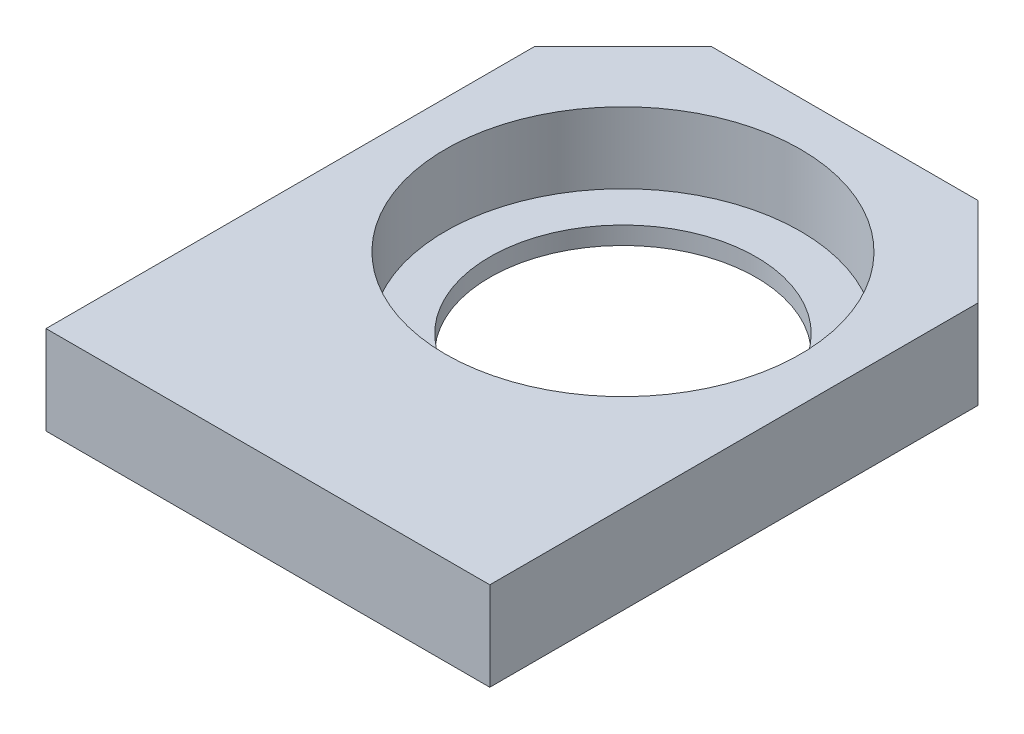
ISO-10303-21;
HEADER;
FILE_DESCRIPTION(('STEP AP214'),'2;1');
FILE_NAME('part.step','',(''),(''),'','','');
FILE_SCHEMA(('AUTOMOTIVE_DESIGN { 1 0 10303 214 1 1 1 1 }'));
ENDSEC;
DATA;
#1=APPLICATION_CONTEXT('core data for automotive mechanical design processes');
#2=APPLICATION_PROTOCOL_DEFINITION('international standard','automotive_design',2000,#1);
#3=PRODUCT_CONTEXT('',#1,'mechanical');
#4=PRODUCT('Part','Part','',(#3));
#5=PRODUCT_RELATED_PRODUCT_CATEGORY('part','',(#4));
#6=PRODUCT_DEFINITION_FORMATION('','',#4);
#7=PRODUCT_DEFINITION_CONTEXT('part definition',#1,'design');
#8=PRODUCT_DEFINITION('design','',#6,#7);
#9=PRODUCT_DEFINITION_SHAPE('','',#8);
#10=(LENGTH_UNIT() NAMED_UNIT(*) SI_UNIT(.MILLI.,.METRE.));
#11=(NAMED_UNIT(*) PLANE_ANGLE_UNIT() SI_UNIT($,.RADIAN.));
#12=(NAMED_UNIT(*) SI_UNIT($,.STERADIAN.) SOLID_ANGLE_UNIT());
#13=UNCERTAINTY_MEASURE_WITH_UNIT(LENGTH_MEASURE(1.E-05),#10,'distance_accuracy_value','');
#14=(GEOMETRIC_REPRESENTATION_CONTEXT(3) GLOBAL_UNCERTAINTY_ASSIGNED_CONTEXT((#13)) GLOBAL_UNIT_ASSIGNED_CONTEXT((#10,
#11,#12)) REPRESENTATION_CONTEXT('',''));
#15=CARTESIAN_POINT('',(0.,0.,0.));
#16=DIRECTION('',(0.,0.,1.));
#17=DIRECTION('',(1.,0.,0.));
#18=AXIS2_PLACEMENT_3D('',#15,#16,#17);
#19=CARTESIAN_POINT('',(15.875,6.35,-20.6375));
#20=DIRECTION('',(0.,0.,1.));
#21=DIRECTION('',(1.,0.,0.));
#22=AXIS2_PLACEMENT_3D('',#19,#20,#21);
#23=PLANE('',#22);
#24=DIRECTION('',(-1.,0.,0.));
#25=VECTOR('',#24,1.);
#26=CARTESIAN_POINT('',(15.875,6.35,-20.6375));
#27=LINE('',#26,#25);
#28=CARTESIAN_POINT('',(9.52499999999998,6.35,-20.6375));
#29=VERTEX_POINT('',#28);
#30=CARTESIAN_POINT('',(-9.52500000000001,6.35,-20.6375));
#31=VERTEX_POINT('',#30);
#32=EDGE_CURVE('E105',#29,#31,#27,.T.);
#33=ORIENTED_EDGE('',*,*,#32,.F.);
#34=DIRECTION('',(0.,-1.,0.));
#35=VECTOR('',#34,1.);
#36=CARTESIAN_POINT('',(9.52499999999998,0.,-20.6375));
#37=LINE('',#36,#35);
#38=CARTESIAN_POINT('',(9.52499999999998,0.,-20.6375));
#39=VERTEX_POINT('',#38);
#40=EDGE_CURVE('E134',#29,#39,#37,.T.);
#41=ORIENTED_EDGE('',*,*,#40,.T.);
#42=DIRECTION('',(-1.,0.,0.));
#43=VECTOR('',#42,1.);
#44=CARTESIAN_POINT('',(15.875,0.,-20.6375));
#45=LINE('',#44,#43);
#46=CARTESIAN_POINT('',(-9.52500000000001,0.,-20.6375));
#47=VERTEX_POINT('',#46);
#48=EDGE_CURVE('E113',#39,#47,#45,.T.);
#49=ORIENTED_EDGE('',*,*,#48,.T.);
#50=DIRECTION('',(0.,1.,0.));
#51=VECTOR('',#50,1.);
#52=CARTESIAN_POINT('',(-9.52500000000001,6.35,-20.6375));
#53=LINE('',#52,#51);
#54=EDGE_CURVE('E131',#47,#31,#53,.T.);
#55=ORIENTED_EDGE('',*,*,#54,.T.);
#56=EDGE_LOOP('',(#33,#41,#49,#55));
#57=FACE_BOUND('',#56,.T.);
#58=ADVANCED_FACE('F33',(#57),#23,.F.);
#59=CARTESIAN_POINT('',(15.875,6.35,20.6375));
#60=DIRECTION('',(0.,-1.,0.));
#61=DIRECTION('',(0.,0.,-1.));
#62=AXIS2_PLACEMENT_3D('',#59,#60,#61);
#63=PLANE('',#62);
#64=CARTESIAN_POINT('',(0.,6.35,-4.7625));
#65=DIRECTION('',(0.,1.,0.));
#66=DIRECTION('',(0.,0.,1.));
#67=AXIS2_PLACEMENT_3D('',#64,#65,#66);
#68=CIRCLE('',#67,12.7);
#69=CARTESIAN_POINT('',(0.,6.35,7.9375));
#70=VERTEX_POINT('',#69);
#71=EDGE_CURVE('E187',#70,#70,#68,.T.);
#72=ORIENTED_EDGE('',*,*,#71,.F.);
#73=EDGE_LOOP('',(#72));
#74=FACE_BOUND('',#73,.T.);
#75=DIRECTION('',(0.,0.,1.));
#76=VECTOR('',#75,1.);
#77=CARTESIAN_POINT('',(15.875,6.35,20.6375));
#78=LINE('',#77,#76);
#79=CARTESIAN_POINT('',(15.875,6.35,-14.2875));
#80=VERTEX_POINT('',#79);
#81=CARTESIAN_POINT('',(15.875,6.35,20.6375));
#82=VERTEX_POINT('',#81);
#83=EDGE_CURVE('E87',#80,#82,#78,.T.);
#84=ORIENTED_EDGE('',*,*,#83,.F.);
#85=DIRECTION('',(-0.707106781186549,0.,-0.707106781186546));
#86=VECTOR('',#85,1.);
#87=CARTESIAN_POINT('',(15.875,6.35,-14.2875));
#88=LINE('',#87,#86);
#89=EDGE_CURVE('E129',#80,#29,#88,.T.);
#90=ORIENTED_EDGE('',*,*,#89,.T.);
#91=ORIENTED_EDGE('',*,*,#32,.T.);
#92=DIRECTION('',(0.707106781186546,0.,-0.707106781186549));
#93=VECTOR('',#92,1.);
#94=CARTESIAN_POINT('',(-9.52500000000001,6.35,-20.6375));
#95=LINE('',#94,#93);
#96=CARTESIAN_POINT('',(-15.875,6.35,-14.2875));
#97=VERTEX_POINT('',#96);
#98=EDGE_CURVE('E127',#31,#97,#95,.F.);
#99=ORIENTED_EDGE('',*,*,#98,.T.);
#100=DIRECTION('',(0.,0.,1.));
#101=VECTOR('',#100,1.);
#102=CARTESIAN_POINT('',(-15.875,6.35,20.6375));
#103=LINE('',#102,#101);
#104=CARTESIAN_POINT('',(-15.875,6.35,20.6375));
#105=VERTEX_POINT('',#104);
#106=EDGE_CURVE('E102',#97,#105,#103,.T.);
#107=ORIENTED_EDGE('',*,*,#106,.T.);
#108=DIRECTION('',(-1.,0.,0.));
#109=VECTOR('',#108,1.);
#110=CARTESIAN_POINT('',(15.875,6.35,20.6375));
#111=LINE('',#110,#109);
#112=EDGE_CURVE('E100',#82,#105,#111,.T.);
#113=ORIENTED_EDGE('',*,*,#112,.F.);
#114=EDGE_LOOP('',(#84,#90,#91,#99,#107,#113));
#115=FACE_BOUND('',#114,.T.);
#116=ADVANCED_FACE('F101',(#74,#115),#63,.F.);
#117=CARTESIAN_POINT('',(15.875,6.35,20.6375));
#118=DIRECTION('',(0.,0.,-1.));
#119=DIRECTION('',(-1.,0.,0.));
#120=AXIS2_PLACEMENT_3D('',#117,#118,#119);
#121=PLANE('',#120);
#122=DIRECTION('',(0.,-1.,0.));
#123=VECTOR('',#122,1.);
#124=CARTESIAN_POINT('',(-15.875,6.35,20.6375));
#125=LINE('',#124,#123);
#126=CARTESIAN_POINT('',(-15.875,0.,20.6375));
#127=VERTEX_POINT('',#126);
#128=EDGE_CURVE('E118',#105,#127,#125,.T.);
#129=ORIENTED_EDGE('',*,*,#128,.T.);
#130=DIRECTION('',(-1.,0.,0.));
#131=VECTOR('',#130,1.);
#132=CARTESIAN_POINT('',(15.875,0.,20.6375));
#133=LINE('',#132,#131);
#134=CARTESIAN_POINT('',(15.875,0.,20.6375));
#135=VERTEX_POINT('',#134);
#136=EDGE_CURVE('E106',#135,#127,#133,.T.);
#137=ORIENTED_EDGE('',*,*,#136,.F.);
#138=DIRECTION('',(0.,-1.,0.));
#139=VECTOR('',#138,1.);
#140=CARTESIAN_POINT('',(15.875,6.35,20.6375));
#141=LINE('',#140,#139);
#142=EDGE_CURVE('E92',#82,#135,#141,.T.);
#143=ORIENTED_EDGE('',*,*,#142,.F.);
#144=ORIENTED_EDGE('',*,*,#112,.T.);
#145=EDGE_LOOP('',(#129,#137,#143,#144));
#146=FACE_BOUND('',#145,.T.);
#147=ADVANCED_FACE('F108',(#146),#121,.F.);
#148=CARTESIAN_POINT('',(15.875,0.,20.6375));
#149=DIRECTION('',(0.,1.,0.));
#150=DIRECTION('',(0.,0.,1.));
#151=AXIS2_PLACEMENT_3D('',#148,#149,#150);
#152=PLANE('',#151);
#153=CARTESIAN_POINT('',(0.,0.,-4.7625));
#154=DIRECTION('',(0.,1.,0.));
#155=DIRECTION('',(0.,0.,1.));
#156=AXIS2_PLACEMENT_3D('',#153,#154,#155);
#157=CIRCLE('',#156,9.525);
#158=CARTESIAN_POINT('',(0.,0.,4.7625));
#159=VERTEX_POINT('',#158);
#160=EDGE_CURVE('E185',#159,#159,#157,.T.);
#161=ORIENTED_EDGE('',*,*,#160,.T.);
#162=EDGE_LOOP('',(#161));
#163=FACE_BOUND('',#162,.T.);
#164=ORIENTED_EDGE('',*,*,#48,.F.);
#165=DIRECTION('',(0.707106781186549,0.,0.707106781186546));
#166=VECTOR('',#165,1.);
#167=CARTESIAN_POINT('',(15.875,0.,-14.2875));
#168=LINE('',#167,#166);
#169=CARTESIAN_POINT('',(15.875,0.,-14.2875));
#170=VERTEX_POINT('',#169);
#171=EDGE_CURVE('E41',#39,#170,#168,.T.);
#172=ORIENTED_EDGE('',*,*,#171,.T.);
#173=DIRECTION('',(0.,0.,-1.));
#174=VECTOR('',#173,1.);
#175=CARTESIAN_POINT('',(15.875,0.,20.6375));
#176=LINE('',#175,#174);
#177=EDGE_CURVE('E111',#135,#170,#176,.T.);
#178=ORIENTED_EDGE('',*,*,#177,.F.);
#179=ORIENTED_EDGE('',*,*,#136,.T.);
#180=DIRECTION('',(0.,0.,-1.));
#181=VECTOR('',#180,1.);
#182=CARTESIAN_POINT('',(-15.875,0.,20.6375));
#183=LINE('',#182,#181);
#184=CARTESIAN_POINT('',(-15.875,0.,-14.2875));
#185=VERTEX_POINT('',#184);
#186=EDGE_CURVE('E97',#127,#185,#183,.T.);
#187=ORIENTED_EDGE('',*,*,#186,.T.);
#188=DIRECTION('',(-0.707106781186546,0.,0.707106781186549));
#189=VECTOR('',#188,1.);
#190=CARTESIAN_POINT('',(-9.52500000000001,0.,-20.6375));
#191=LINE('',#190,#189);
#192=EDGE_CURVE('E53',#185,#47,#191,.F.);
#193=ORIENTED_EDGE('',*,*,#192,.T.);
#194=EDGE_LOOP('',(#164,#172,#178,#179,#187,#193));
#195=FACE_BOUND('',#194,.T.);
#196=ADVANCED_FACE('F137',(#163,#195),#152,.F.);
#197=CARTESIAN_POINT('',(15.875,0.,0.));
#198=DIRECTION('',(1.,0.,0.));
#199=DIRECTION('',(0.,0.,-1.));
#200=AXIS2_PLACEMENT_3D('',#197,#198,#199);
#201=PLANE('',#200);
#202=ORIENTED_EDGE('',*,*,#177,.T.);
#203=DIRECTION('',(0.,1.,0.));
#204=VECTOR('',#203,1.);
#205=CARTESIAN_POINT('',(15.875,6.35,-14.2875));
#206=LINE('',#205,#204);
#207=EDGE_CURVE('E95',#170,#80,#206,.T.);
#208=ORIENTED_EDGE('',*,*,#207,.T.);
#209=ORIENTED_EDGE('',*,*,#83,.T.);
#210=ORIENTED_EDGE('',*,*,#142,.T.);
#211=EDGE_LOOP('',(#202,#208,#209,#210));
#212=FACE_BOUND('',#211,.T.);
#213=ADVANCED_FACE('F90',(#212),#201,.T.);
#214=CARTESIAN_POINT('',(-15.875,0.,0.));
#215=DIRECTION('',(1.,0.,0.));
#216=DIRECTION('',(0.,0.,-1.));
#217=AXIS2_PLACEMENT_3D('',#214,#215,#216);
#218=PLANE('',#217);
#219=ORIENTED_EDGE('',*,*,#106,.F.);
#220=DIRECTION('',(0.,-1.,0.));
#221=VECTOR('',#220,1.);
#222=CARTESIAN_POINT('',(-15.875,0.,-14.2875));
#223=LINE('',#222,#221);
#224=EDGE_CURVE('E11',#97,#185,#223,.T.);
#225=ORIENTED_EDGE('',*,*,#224,.T.);
#226=ORIENTED_EDGE('',*,*,#186,.F.);
#227=ORIENTED_EDGE('',*,*,#128,.F.);
#228=EDGE_LOOP('',(#219,#225,#226,#227));
#229=FACE_BOUND('',#228,.T.);
#230=ADVANCED_FACE('F145',(#229),#218,.F.);
#231=CARTESIAN_POINT('',(0.,1.27,-4.7625));
#232=DIRECTION('',(0.,1.,0.));
#233=DIRECTION('',(0.,0.,1.));
#234=AXIS2_PLACEMENT_3D('',#231,#232,#233);
#235=CYLINDRICAL_SURFACE('',#234,12.7);
#236=CARTESIAN_POINT('',(0.,1.27,-4.7625));
#237=DIRECTION('',(0.,1.,0.));
#238=DIRECTION('',(0.,0.,1.));
#239=AXIS2_PLACEMENT_3D('',#236,#237,#238);
#240=CIRCLE('',#239,12.7);
#241=CARTESIAN_POINT('',(0.,1.27,7.9375));
#242=VERTEX_POINT('',#241);
#243=EDGE_CURVE('E119',#242,#242,#240,.T.);
#244=ORIENTED_EDGE('',*,*,#243,.F.);
#245=EDGE_LOOP('',(#244));
#246=FACE_BOUND('',#245,.T.);
#247=ORIENTED_EDGE('',*,*,#71,.T.);
#248=EDGE_LOOP('',(#247));
#249=FACE_BOUND('',#248,.T.);
#250=ADVANCED_FACE('F147',(#246,#249),#235,.F.);
#251=CARTESIAN_POINT('',(0.,1.27,-4.7625));
#252=DIRECTION('',(0.,1.,0.));
#253=DIRECTION('',(0.,0.,1.));
#254=AXIS2_PLACEMENT_3D('',#251,#252,#253);
#255=PLANE('',#254);
#256=CARTESIAN_POINT('',(0.,1.27,-4.7625));
#257=DIRECTION('',(0.,1.,0.));
#258=DIRECTION('',(0.,0.,1.));
#259=AXIS2_PLACEMENT_3D('',#256,#257,#258);
#260=CIRCLE('',#259,9.525);
#261=CARTESIAN_POINT('',(0.,1.27,4.7625));
#262=VERTEX_POINT('',#261);
#263=EDGE_CURVE('E182',#262,#262,#260,.T.);
#264=ORIENTED_EDGE('',*,*,#263,.F.);
#265=EDGE_LOOP('',(#264));
#266=FACE_BOUND('',#265,.T.);
#267=ORIENTED_EDGE('',*,*,#243,.T.);
#268=EDGE_LOOP('',(#267));
#269=FACE_BOUND('',#268,.T.);
#270=ADVANCED_FACE('F153',(#266,#269),#255,.T.);
#271=CARTESIAN_POINT('',(0.,-5.08,-4.7625));
#272=DIRECTION('',(0.,1.,0.));
#273=DIRECTION('',(0.,0.,1.));
#274=AXIS2_PLACEMENT_3D('',#271,#272,#273);
#275=CYLINDRICAL_SURFACE('',#274,9.525);
#276=ORIENTED_EDGE('',*,*,#263,.T.);
#277=EDGE_LOOP('',(#276));
#278=FACE_BOUND('',#277,.T.);
#279=ORIENTED_EDGE('',*,*,#160,.F.);
#280=EDGE_LOOP('',(#279));
#281=FACE_BOUND('',#280,.T.);
#282=ADVANCED_FACE('F167',(#278,#281),#275,.F.);
#283=CARTESIAN_POINT('',(15.875,0.,-14.2875));
#284=DIRECTION('',(0.707106781186546,0.,-0.707106781186549));
#285=DIRECTION('',(0.,-1.,0.));
#286=AXIS2_PLACEMENT_3D('',#283,#284,#285);
#287=PLANE('',#286);
#288=ORIENTED_EDGE('',*,*,#171,.F.);
#289=ORIENTED_EDGE('',*,*,#40,.F.);
#290=ORIENTED_EDGE('',*,*,#89,.F.);
#291=ORIENTED_EDGE('',*,*,#207,.F.);
#292=EDGE_LOOP('',(#288,#289,#290,#291));
#293=FACE_BOUND('',#292,.T.);
#294=ADVANCED_FACE('F140',(#293),#287,.T.);
#295=CARTESIAN_POINT('',(-9.52500000000001,6.35,-20.6375));
#296=DIRECTION('',(0.707106781186549,0.,0.707106781186546));
#297=DIRECTION('',(0.,1.,0.));
#298=AXIS2_PLACEMENT_3D('',#295,#296,#297);
#299=PLANE('',#298);
#300=ORIENTED_EDGE('',*,*,#192,.F.);
#301=ORIENTED_EDGE('',*,*,#224,.F.);
#302=ORIENTED_EDGE('',*,*,#98,.F.);
#303=ORIENTED_EDGE('',*,*,#54,.F.);
#304=EDGE_LOOP('',(#300,#301,#302,#303));
#305=FACE_BOUND('',#304,.T.);
#306=ADVANCED_FACE('F35',(#305),#299,.F.);
#307=CLOSED_SHELL('',(#58,#116,#147,#196,#213,#230,#250,#270,#282,#294,#306));
#308=MANIFOLD_SOLID_BREP('B2',#307);
#309=ADVANCED_BREP_SHAPE_REPRESENTATION('',(#18,#308),#14);
#310=SHAPE_DEFINITION_REPRESENTATION(#9,#309);
ENDSEC;
END-ISO-10303-21;
